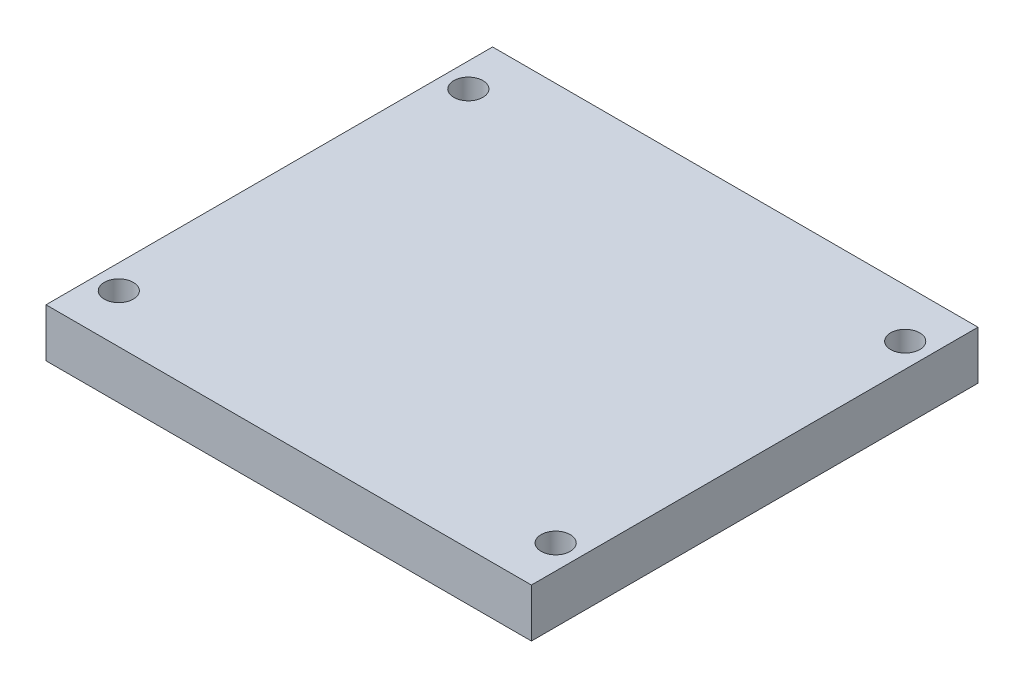
ISO-10303-21;
HEADER;
FILE_DESCRIPTION(('STEP AP214'),'2;1');
FILE_NAME('part.step','',(''),(''),'','','');
FILE_SCHEMA(('AUTOMOTIVE_DESIGN { 1 0 10303 214 1 1 1 1 }'));
ENDSEC;
DATA;
#1=APPLICATION_CONTEXT('core data for automotive mechanical design processes');
#2=APPLICATION_PROTOCOL_DEFINITION('international standard','automotive_design',2000,#1);
#3=PRODUCT_CONTEXT('',#1,'mechanical');
#4=PRODUCT('Part','Part','',(#3));
#5=PRODUCT_RELATED_PRODUCT_CATEGORY('part','',(#4));
#6=PRODUCT_DEFINITION_FORMATION('','',#4);
#7=PRODUCT_DEFINITION_CONTEXT('part definition',#1,'design');
#8=PRODUCT_DEFINITION('design','',#6,#7);
#9=PRODUCT_DEFINITION_SHAPE('','',#8);
#10=(LENGTH_UNIT() NAMED_UNIT(*) SI_UNIT(.MILLI.,.METRE.));
#11=(NAMED_UNIT(*) PLANE_ANGLE_UNIT() SI_UNIT($,.RADIAN.));
#12=(NAMED_UNIT(*) SI_UNIT($,.STERADIAN.) SOLID_ANGLE_UNIT());
#13=UNCERTAINTY_MEASURE_WITH_UNIT(LENGTH_MEASURE(1.E-05),#10,'distance_accuracy_value','');
#14=(GEOMETRIC_REPRESENTATION_CONTEXT(3) GLOBAL_UNCERTAINTY_ASSIGNED_CONTEXT((#13)) GLOBAL_UNIT_ASSIGNED_CONTEXT((#10,
#11,#12)) REPRESENTATION_CONTEXT('',''));
#15=CARTESIAN_POINT('',(0.,0.,0.));
#16=DIRECTION('',(0.,0.,1.));
#17=DIRECTION('',(1.,0.,0.));
#18=AXIS2_PLACEMENT_3D('',#15,#16,#17);
#19=CARTESIAN_POINT('',(0.,5.,0.));
#20=DIRECTION('',(0.,-1.,0.));
#21=DIRECTION('',(0.,0.,-1.));
#22=AXIS2_PLACEMENT_3D('',#19,#20,#21);
#23=PLANE('',#22);
#24=CARTESIAN_POINT('',(22.5,5.,-5.));
#25=DIRECTION('',(0.,1.,0.));
#26=DIRECTION('',(0.,0.,1.));
#27=AXIS2_PLACEMENT_3D('',#24,#25,#26);
#28=CIRCLE('',#27,1.5);
#29=CARTESIAN_POINT('',(22.5,5.,-3.5));
#30=VERTEX_POINT('',#29);
#31=EDGE_CURVE('E82',#30,#30,#28,.T.);
#32=ORIENTED_EDGE('',*,*,#31,.F.);
#33=EDGE_LOOP('',(#32));
#34=FACE_BOUND('',#33,.T.);
#35=DIRECTION('',(-1.,0.,0.));
#36=VECTOR('',#35,1.);
#37=CARTESIAN_POINT('',(0.,5.,-46.));
#38=LINE('',#37,#36);
#39=CARTESIAN_POINT('',(25.,5.,-46.));
#40=VERTEX_POINT('',#39);
#41=CARTESIAN_POINT('',(-25.,5.,-46.));
#42=VERTEX_POINT('',#41);
#43=EDGE_CURVE('E117',#40,#42,#38,.T.);
#44=ORIENTED_EDGE('',*,*,#43,.T.);
#45=DIRECTION('',(0.,0.,-1.));
#46=VECTOR('',#45,1.);
#47=CARTESIAN_POINT('',(-25.,5.,0.));
#48=LINE('',#47,#46);
#49=CARTESIAN_POINT('',(-25.,5.,0.));
#50=VERTEX_POINT('',#49);
#51=EDGE_CURVE('E89',#50,#42,#48,.T.);
#52=ORIENTED_EDGE('',*,*,#51,.F.);
#53=DIRECTION('',(1.,0.,0.));
#54=VECTOR('',#53,1.);
#55=CARTESIAN_POINT('',(0.,5.,0.));
#56=LINE('',#55,#54);
#57=CARTESIAN_POINT('',(25.,5.,0.));
#58=VERTEX_POINT('',#57);
#59=EDGE_CURVE('E66',#50,#58,#56,.T.);
#60=ORIENTED_EDGE('',*,*,#59,.T.);
#61=DIRECTION('',(0.,0.,-1.));
#62=VECTOR('',#61,1.);
#63=CARTESIAN_POINT('',(25.,5.,0.));
#64=LINE('',#63,#62);
#65=EDGE_CURVE('E50',#58,#40,#64,.T.);
#66=ORIENTED_EDGE('',*,*,#65,.T.);
#67=EDGE_LOOP('',(#44,#52,#60,#66));
#68=FACE_BOUND('',#67,.T.);
#69=CARTESIAN_POINT('',(22.5,5.,-41.));
#70=DIRECTION('',(0.,1.,0.));
#71=DIRECTION('',(0.,0.,1.));
#72=AXIS2_PLACEMENT_3D('',#69,#70,#71);
#73=CIRCLE('',#72,1.5);
#74=CARTESIAN_POINT('',(22.5,5.,-39.5));
#75=VERTEX_POINT('',#74);
#76=EDGE_CURVE('E104',#75,#75,#73,.T.);
#77=ORIENTED_EDGE('',*,*,#76,.F.);
#78=EDGE_LOOP('',(#77));
#79=FACE_BOUND('',#78,.T.);
#80=CARTESIAN_POINT('',(-22.5,5.,-41.));
#81=DIRECTION('',(0.,-1.,0.));
#82=DIRECTION('',(0.,0.,1.));
#83=AXIS2_PLACEMENT_3D('',#80,#81,#82);
#84=CIRCLE('',#83,1.5);
#85=CARTESIAN_POINT('',(-22.5,5.,-39.5));
#86=VERTEX_POINT('',#85);
#87=EDGE_CURVE('E164',#86,#86,#84,.T.);
#88=ORIENTED_EDGE('',*,*,#87,.T.);
#89=EDGE_LOOP('',(#88));
#90=FACE_BOUND('',#89,.T.);
#91=CARTESIAN_POINT('',(-22.5,5.,-5.));
#92=DIRECTION('',(0.,-1.,0.));
#93=DIRECTION('',(0.,0.,1.));
#94=AXIS2_PLACEMENT_3D('',#91,#92,#93);
#95=CIRCLE('',#94,1.5);
#96=CARTESIAN_POINT('',(-22.5,5.,-3.5));
#97=VERTEX_POINT('',#96);
#98=EDGE_CURVE('E94',#97,#97,#95,.T.);
#99=ORIENTED_EDGE('',*,*,#98,.T.);
#100=EDGE_LOOP('',(#99));
#101=FACE_BOUND('',#100,.T.);
#102=ADVANCED_FACE('F33',(#34,#68,#79,#90,#101),#23,.F.);
#103=CARTESIAN_POINT('',(0.,0.,0.));
#104=DIRECTION('',(0.,-1.,0.));
#105=DIRECTION('',(0.,0.,-1.));
#106=AXIS2_PLACEMENT_3D('',#103,#104,#105);
#107=PLANE('',#106);
#108=CARTESIAN_POINT('',(22.5,0.,-5.));
#109=DIRECTION('',(0.,1.,0.));
#110=DIRECTION('',(0.,0.,1.));
#111=AXIS2_PLACEMENT_3D('',#108,#109,#110);
#112=CIRCLE('',#111,1.5);
#113=CARTESIAN_POINT('',(22.5,0.,-3.5));
#114=VERTEX_POINT('',#113);
#115=EDGE_CURVE('E107',#114,#114,#112,.T.);
#116=ORIENTED_EDGE('',*,*,#115,.T.);
#117=EDGE_LOOP('',(#116));
#118=FACE_BOUND('',#117,.T.);
#119=DIRECTION('',(1.,0.,0.));
#120=VECTOR('',#119,1.);
#121=CARTESIAN_POINT('',(0.,0.,0.));
#122=LINE('',#121,#120);
#123=CARTESIAN_POINT('',(-25.,0.,0.));
#124=VERTEX_POINT('',#123);
#125=CARTESIAN_POINT('',(25.,0.,0.));
#126=VERTEX_POINT('',#125);
#127=EDGE_CURVE('E61',#124,#126,#122,.T.);
#128=ORIENTED_EDGE('',*,*,#127,.F.);
#129=DIRECTION('',(0.,0.,-1.));
#130=VECTOR('',#129,1.);
#131=CARTESIAN_POINT('',(-25.,0.,0.));
#132=LINE('',#131,#130);
#133=CARTESIAN_POINT('',(-25.,0.,-46.));
#134=VERTEX_POINT('',#133);
#135=EDGE_CURVE('E80',#124,#134,#132,.T.);
#136=ORIENTED_EDGE('',*,*,#135,.T.);
#137=DIRECTION('',(-1.,0.,0.));
#138=VECTOR('',#137,1.);
#139=CARTESIAN_POINT('',(0.,0.,-46.));
#140=LINE('',#139,#138);
#141=CARTESIAN_POINT('',(25.,0.,-46.));
#142=VERTEX_POINT('',#141);
#143=EDGE_CURVE('E115',#142,#134,#140,.T.);
#144=ORIENTED_EDGE('',*,*,#143,.F.);
#145=DIRECTION('',(0.,0.,-1.));
#146=VECTOR('',#145,1.);
#147=CARTESIAN_POINT('',(25.,0.,0.));
#148=LINE('',#147,#146);
#149=EDGE_CURVE('E81',#126,#142,#148,.T.);
#150=ORIENTED_EDGE('',*,*,#149,.F.);
#151=EDGE_LOOP('',(#128,#136,#144,#150));
#152=FACE_BOUND('',#151,.T.);
#153=CARTESIAN_POINT('',(22.5,0.,-41.));
#154=DIRECTION('',(0.,1.,0.));
#155=DIRECTION('',(0.,0.,1.));
#156=AXIS2_PLACEMENT_3D('',#153,#154,#155);
#157=CIRCLE('',#156,1.5);
#158=CARTESIAN_POINT('',(22.5,0.,-39.5));
#159=VERTEX_POINT('',#158);
#160=EDGE_CURVE('E103',#159,#159,#157,.T.);
#161=ORIENTED_EDGE('',*,*,#160,.T.);
#162=EDGE_LOOP('',(#161));
#163=FACE_BOUND('',#162,.T.);
#164=CARTESIAN_POINT('',(-22.5,0.,-41.));
#165=DIRECTION('',(0.,-1.,0.));
#166=DIRECTION('',(0.,0.,1.));
#167=AXIS2_PLACEMENT_3D('',#164,#165,#166);
#168=CIRCLE('',#167,1.5);
#169=CARTESIAN_POINT('',(-22.5,0.,-39.5));
#170=VERTEX_POINT('',#169);
#171=EDGE_CURVE('E167',#170,#170,#168,.T.);
#172=ORIENTED_EDGE('',*,*,#171,.F.);
#173=EDGE_LOOP('',(#172));
#174=FACE_BOUND('',#173,.T.);
#175=CARTESIAN_POINT('',(-22.5,0.,-5.));
#176=DIRECTION('',(0.,-1.,0.));
#177=DIRECTION('',(0.,0.,1.));
#178=AXIS2_PLACEMENT_3D('',#175,#176,#177);
#179=CIRCLE('',#178,1.5);
#180=CARTESIAN_POINT('',(-22.5,0.,-3.5));
#181=VERTEX_POINT('',#180);
#182=EDGE_CURVE('E98',#181,#181,#179,.T.);
#183=ORIENTED_EDGE('',*,*,#182,.F.);
#184=EDGE_LOOP('',(#183));
#185=FACE_BOUND('',#184,.T.);
#186=ADVANCED_FACE('F76',(#118,#152,#163,#174,#185),#107,.T.);
#187=CARTESIAN_POINT('',(0.,5.,0.));
#188=DIRECTION('',(0.,0.,-1.));
#189=DIRECTION('',(-1.,0.,0.));
#190=AXIS2_PLACEMENT_3D('',#187,#188,#189);
#191=PLANE('',#190);
#192=ORIENTED_EDGE('',*,*,#127,.T.);
#193=DIRECTION('',(0.,-1.,0.));
#194=VECTOR('',#193,1.);
#195=CARTESIAN_POINT('',(25.,5.,0.));
#196=LINE('',#195,#194);
#197=EDGE_CURVE('E11',#58,#126,#196,.T.);
#198=ORIENTED_EDGE('',*,*,#197,.F.);
#199=ORIENTED_EDGE('',*,*,#59,.F.);
#200=DIRECTION('',(0.,-1.,0.));
#201=VECTOR('',#200,1.);
#202=CARTESIAN_POINT('',(-25.,5.,0.));
#203=LINE('',#202,#201);
#204=EDGE_CURVE('E84',#50,#124,#203,.T.);
#205=ORIENTED_EDGE('',*,*,#204,.T.);
#206=EDGE_LOOP('',(#192,#198,#199,#205));
#207=FACE_BOUND('',#206,.T.);
#208=ADVANCED_FACE('F35',(#207),#191,.F.);
#209=CARTESIAN_POINT('',(25.,5.,0.));
#210=DIRECTION('',(-1.,0.,0.));
#211=DIRECTION('',(0.,0.,1.));
#212=AXIS2_PLACEMENT_3D('',#209,#210,#211);
#213=PLANE('',#212);
#214=ORIENTED_EDGE('',*,*,#149,.T.);
#215=DIRECTION('',(0.,-1.,0.));
#216=VECTOR('',#215,1.);
#217=CARTESIAN_POINT('',(25.,5.,-46.));
#218=LINE('',#217,#216);
#219=EDGE_CURVE('E42',#40,#142,#218,.T.);
#220=ORIENTED_EDGE('',*,*,#219,.F.);
#221=ORIENTED_EDGE('',*,*,#65,.F.);
#222=ORIENTED_EDGE('',*,*,#197,.T.);
#223=EDGE_LOOP('',(#214,#220,#221,#222));
#224=FACE_BOUND('',#223,.T.);
#225=ADVANCED_FACE('F125',(#224),#213,.F.);
#226=CARTESIAN_POINT('',(0.,5.,-46.));
#227=DIRECTION('',(0.,0.,1.));
#228=DIRECTION('',(1.,0.,0.));
#229=AXIS2_PLACEMENT_3D('',#226,#227,#228);
#230=PLANE('',#229);
#231=ORIENTED_EDGE('',*,*,#143,.T.);
#232=DIRECTION('',(0.,-1.,0.));
#233=VECTOR('',#232,1.);
#234=CARTESIAN_POINT('',(-25.,5.,-46.));
#235=LINE('',#234,#233);
#236=EDGE_CURVE('E88',#42,#134,#235,.T.);
#237=ORIENTED_EDGE('',*,*,#236,.F.);
#238=ORIENTED_EDGE('',*,*,#43,.F.);
#239=ORIENTED_EDGE('',*,*,#219,.T.);
#240=EDGE_LOOP('',(#231,#237,#238,#239));
#241=FACE_BOUND('',#240,.T.);
#242=ADVANCED_FACE('F123',(#241),#230,.F.);
#243=CARTESIAN_POINT('',(22.5,5.,-5.));
#244=DIRECTION('',(0.,-1.,0.));
#245=DIRECTION('',(0.,0.,-1.));
#246=AXIS2_PLACEMENT_3D('',#243,#244,#245);
#247=CYLINDRICAL_SURFACE('',#246,1.5);
#248=ORIENTED_EDGE('',*,*,#31,.T.);
#249=EDGE_LOOP('',(#248));
#250=FACE_BOUND('',#249,.T.);
#251=ORIENTED_EDGE('',*,*,#115,.F.);
#252=EDGE_LOOP('',(#251));
#253=FACE_BOUND('',#252,.T.);
#254=ADVANCED_FACE('F131',(#250,#253),#247,.F.);
#255=CARTESIAN_POINT('',(22.5,5.,-41.));
#256=DIRECTION('',(0.,-1.,0.));
#257=DIRECTION('',(0.,0.,-1.));
#258=AXIS2_PLACEMENT_3D('',#255,#256,#257);
#259=CYLINDRICAL_SURFACE('',#258,1.5);
#260=ORIENTED_EDGE('',*,*,#76,.T.);
#261=EDGE_LOOP('',(#260));
#262=FACE_BOUND('',#261,.T.);
#263=ORIENTED_EDGE('',*,*,#160,.F.);
#264=EDGE_LOOP('',(#263));
#265=FACE_BOUND('',#264,.T.);
#266=ADVANCED_FACE('F145',(#262,#265),#259,.F.);
#267=CARTESIAN_POINT('',(-25.,5.,0.));
#268=DIRECTION('',(-1.,0.,0.));
#269=DIRECTION('',(0.,0.,1.));
#270=AXIS2_PLACEMENT_3D('',#267,#268,#269);
#271=PLANE('',#270);
#272=ORIENTED_EDGE('',*,*,#135,.F.);
#273=ORIENTED_EDGE('',*,*,#204,.F.);
#274=ORIENTED_EDGE('',*,*,#51,.T.);
#275=ORIENTED_EDGE('',*,*,#236,.T.);
#276=EDGE_LOOP('',(#272,#273,#274,#275));
#277=FACE_BOUND('',#276,.T.);
#278=ADVANCED_FACE('F92',(#277),#271,.T.);
#279=CARTESIAN_POINT('',(-22.5,5.,-5.));
#280=DIRECTION('',(0.,-1.,0.));
#281=DIRECTION('',(0.,0.,-1.));
#282=AXIS2_PLACEMENT_3D('',#279,#280,#281);
#283=CYLINDRICAL_SURFACE('',#282,1.5);
#284=ORIENTED_EDGE('',*,*,#98,.F.);
#285=EDGE_LOOP('',(#284));
#286=FACE_BOUND('',#285,.T.);
#287=ORIENTED_EDGE('',*,*,#182,.T.);
#288=EDGE_LOOP('',(#287));
#289=FACE_BOUND('',#288,.T.);
#290=ADVANCED_FACE('F152',(#286,#289),#283,.F.);
#291=CARTESIAN_POINT('',(-22.5,5.,-41.));
#292=DIRECTION('',(0.,-1.,0.));
#293=DIRECTION('',(0.,0.,-1.));
#294=AXIS2_PLACEMENT_3D('',#291,#292,#293);
#295=CYLINDRICAL_SURFACE('',#294,1.5);
#296=ORIENTED_EDGE('',*,*,#87,.F.);
#297=EDGE_LOOP('',(#296));
#298=FACE_BOUND('',#297,.T.);
#299=ORIENTED_EDGE('',*,*,#171,.T.);
#300=EDGE_LOOP('',(#299));
#301=FACE_BOUND('',#300,.T.);
#302=ADVANCED_FACE('F155',(#298,#301),#295,.F.);
#303=CLOSED_SHELL('',(#102,#186,#208,#225,#242,#254,#266,#278,#290,#302));
#304=MANIFOLD_SOLID_BREP('B2',#303);
#305=ADVANCED_BREP_SHAPE_REPRESENTATION('',(#18,#304),#14);
#306=SHAPE_DEFINITION_REPRESENTATION(#9,#305);
ENDSEC;
END-ISO-10303-21;
